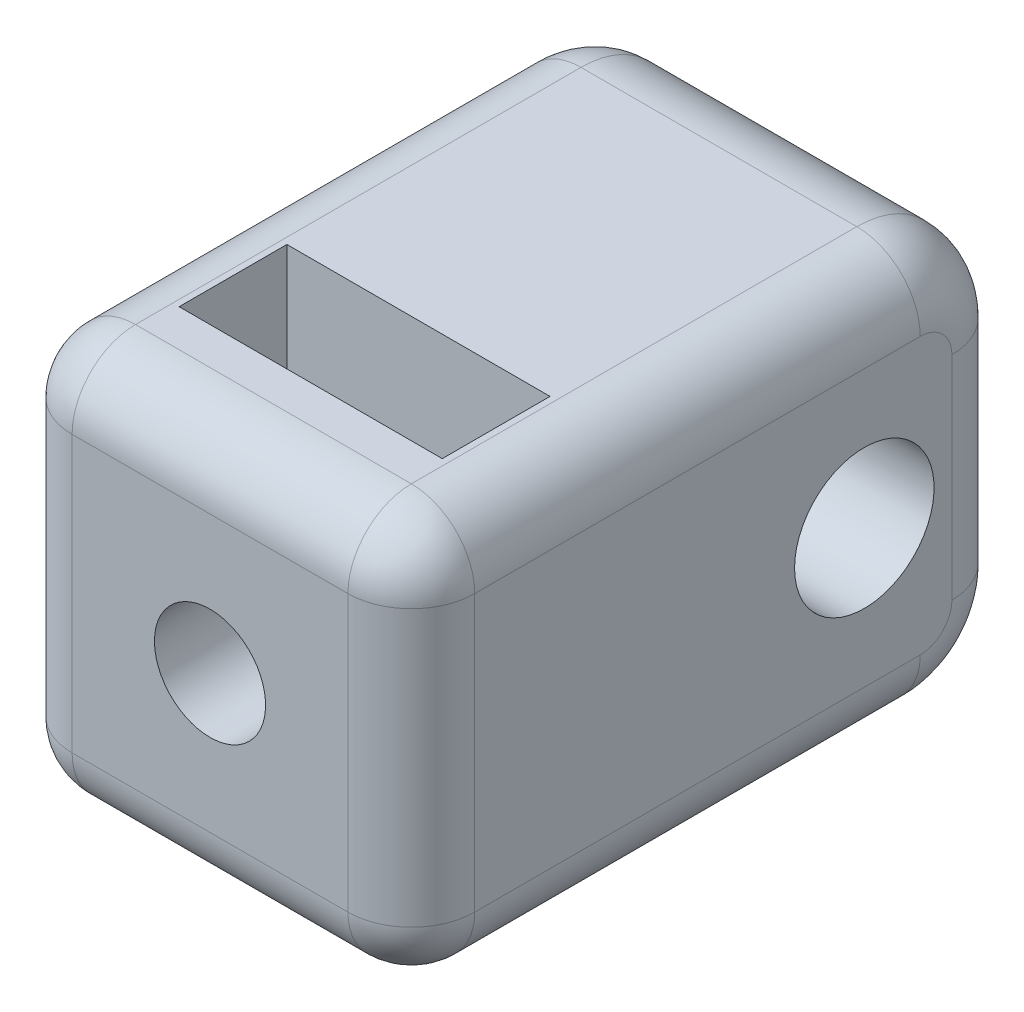
ISO-10303-21;
HEADER;
FILE_DESCRIPTION(('STEP AP214'),'2;1');
FILE_NAME('part.step','',(''),(''),'','','');
FILE_SCHEMA(('AUTOMOTIVE_DESIGN { 1 0 10303 214 1 1 1 1 }'));
ENDSEC;
DATA;
#1=APPLICATION_CONTEXT('core data for automotive mechanical design processes');
#2=APPLICATION_PROTOCOL_DEFINITION('international standard','automotive_design',2000,#1);
#3=PRODUCT_CONTEXT('',#1,'mechanical');
#4=PRODUCT('Part','Part','',(#3));
#5=PRODUCT_RELATED_PRODUCT_CATEGORY('part','',(#4));
#6=PRODUCT_DEFINITION_FORMATION('','',#4);
#7=PRODUCT_DEFINITION_CONTEXT('part definition',#1,'design');
#8=PRODUCT_DEFINITION('design','',#6,#7);
#9=PRODUCT_DEFINITION_SHAPE('','',#8);
#10=(LENGTH_UNIT() NAMED_UNIT(*) SI_UNIT(.MILLI.,.METRE.));
#11=(NAMED_UNIT(*) PLANE_ANGLE_UNIT() SI_UNIT($,.RADIAN.));
#12=(NAMED_UNIT(*) SI_UNIT($,.STERADIAN.) SOLID_ANGLE_UNIT());
#13=UNCERTAINTY_MEASURE_WITH_UNIT(LENGTH_MEASURE(1.E-05),#10,'distance_accuracy_value','');
#14=(GEOMETRIC_REPRESENTATION_CONTEXT(3) GLOBAL_UNCERTAINTY_ASSIGNED_CONTEXT((#13)) GLOBAL_UNIT_ASSIGNED_CONTEXT((#10,
#11,#12)) REPRESENTATION_CONTEXT('',''));
#15=CARTESIAN_POINT('',(0.,0.,0.));
#16=DIRECTION('',(0.,0.,1.));
#17=DIRECTION('',(1.,0.,0.));
#18=AXIS2_PLACEMENT_3D('',#15,#16,#17);
#19=CARTESIAN_POINT('',(0.,12.7,0.));
#20=DIRECTION('',(0.,-1.,0.));
#21=DIRECTION('',(0.,0.,-1.));
#22=AXIS2_PLACEMENT_3D('',#19,#20,#21);
#23=PLANE('',#22);
#24=DIRECTION('',(-1.,0.,0.));
#25=VECTOR('',#24,1.);
#26=CARTESIAN_POINT('',(0.,12.7,3.));
#27=LINE('',#26,#25);
#28=CARTESIAN_POINT('',(-40.1,12.7,3.));
#29=VERTEX_POINT('',#28);
#30=CARTESIAN_POINT('',(-48.8,12.7,3.));
#31=VERTEX_POINT('',#30);
#32=EDGE_CURVE('E257',#29,#31,#27,.T.);
#33=ORIENTED_EDGE('',*,*,#32,.T.);
#34=DIRECTION('',(0.,0.,1.));
#35=VECTOR('',#34,1.);
#36=CARTESIAN_POINT('',(-48.8,12.7,0.));
#37=LINE('',#36,#35);
#38=CARTESIAN_POINT('',(-48.8,12.7,17.05));
#39=VERTEX_POINT('',#38);
#40=EDGE_CURVE('E11',#31,#39,#37,.T.);
#41=ORIENTED_EDGE('',*,*,#40,.T.);
#42=DIRECTION('',(1.,0.,0.));
#43=VECTOR('',#42,1.);
#44=CARTESIAN_POINT('',(0.,12.7,17.05));
#45=LINE('',#44,#43);
#46=CARTESIAN_POINT('',(-40.1,12.7,17.05));
#47=VERTEX_POINT('',#46);
#48=EDGE_CURVE('E273',#39,#47,#45,.T.);
#49=ORIENTED_EDGE('',*,*,#48,.T.);
#50=DIRECTION('',(0.,0.,1.));
#51=VECTOR('',#50,1.);
#52=CARTESIAN_POINT('',(-40.1,12.7,0.));
#53=LINE('',#52,#51);
#54=EDGE_CURVE('E51',#47,#29,#53,.F.);
#55=ORIENTED_EDGE('',*,*,#54,.T.);
#56=EDGE_LOOP('',(#33,#41,#49,#55));
#57=FACE_BOUND('',#56,.T.);
#58=DIRECTION('',(1.,0.,0.));
#59=VECTOR('',#58,1.);
#60=CARTESIAN_POINT('',(0.,12.7,12.475));
#61=LINE('',#60,#59);
#62=CARTESIAN_POINT('',(-48.6,12.7,12.475));
#63=VERTEX_POINT('',#62);
#64=CARTESIAN_POINT('',(-40.3,12.7,12.475));
#65=VERTEX_POINT('',#64);
#66=EDGE_CURVE('E187',#63,#65,#61,.T.);
#67=ORIENTED_EDGE('',*,*,#66,.T.);
#68=DIRECTION('',(0.,0.,1.));
#69=VECTOR('',#68,1.);
#70=CARTESIAN_POINT('',(-40.3,12.7,12.475));
#71=LINE('',#70,#69);
#72=CARTESIAN_POINT('',(-40.3,12.7,15.875));
#73=VERTEX_POINT('',#72);
#74=EDGE_CURVE('E233',#65,#73,#71,.T.);
#75=ORIENTED_EDGE('',*,*,#74,.T.);
#76=DIRECTION('',(1.,0.,0.));
#77=VECTOR('',#76,1.);
#78=CARTESIAN_POINT('',(0.,12.7,15.875));
#79=LINE('',#78,#77);
#80=CARTESIAN_POINT('',(-48.6,12.7,15.875));
#81=VERTEX_POINT('',#80);
#82=EDGE_CURVE('E197',#81,#73,#79,.T.);
#83=ORIENTED_EDGE('',*,*,#82,.F.);
#84=DIRECTION('',(0.,0.,1.));
#85=VECTOR('',#84,1.);
#86=CARTESIAN_POINT('',(-48.6,12.7,12.475));
#87=LINE('',#86,#85);
#88=EDGE_CURVE('E229',#63,#81,#87,.T.);
#89=ORIENTED_EDGE('',*,*,#88,.F.);
#90=EDGE_LOOP('',(#67,#75,#83,#89));
#91=FACE_BOUND('',#90,.T.);
#92=ADVANCED_FACE('F41',(#57,#91),#23,.F.);
#93=CARTESIAN_POINT('',(0.,12.7,0.));
#94=DIRECTION('',(0.,0.,1.));
#95=DIRECTION('',(1.,0.,0.));
#96=AXIS2_PLACEMENT_3D('',#93,#94,#95);
#97=PLANE('',#96);
#98=DIRECTION('',(-1.,0.,0.));
#99=VECTOR('',#98,1.);
#100=CARTESIAN_POINT('',(-50.8,3.,0.));
#101=LINE('',#100,#99);
#102=CARTESIAN_POINT('',(-40.1,3.,0.));
#103=VERTEX_POINT('',#102);
#104=CARTESIAN_POINT('',(-48.8,3.,0.));
#105=VERTEX_POINT('',#104);
#106=EDGE_CURVE('E249',#103,#105,#101,.T.);
#107=ORIENTED_EDGE('',*,*,#106,.T.);
#108=DIRECTION('',(0.,-1.,0.));
#109=VECTOR('',#108,1.);
#110=CARTESIAN_POINT('',(-48.8,12.7,0.));
#111=LINE('',#110,#109);
#112=CARTESIAN_POINT('',(-48.8,9.7,0.));
#113=VERTEX_POINT('',#112);
#114=EDGE_CURVE('E307',#105,#113,#111,.F.);
#115=ORIENTED_EDGE('',*,*,#114,.T.);
#116=DIRECTION('',(-1.,0.,0.));
#117=VECTOR('',#116,1.);
#118=CARTESIAN_POINT('',(0.,9.7,0.));
#119=LINE('',#118,#117);
#120=CARTESIAN_POINT('',(-40.1,9.7,0.));
#121=VERTEX_POINT('',#120);
#122=EDGE_CURVE('E245',#113,#121,#119,.F.);
#123=ORIENTED_EDGE('',*,*,#122,.T.);
#124=DIRECTION('',(0.,1.,0.));
#125=VECTOR('',#124,1.);
#126=CARTESIAN_POINT('',(-40.1,12.7,0.));
#127=LINE('',#126,#125);
#128=EDGE_CURVE('E304',#121,#103,#127,.F.);
#129=ORIENTED_EDGE('',*,*,#128,.T.);
#130=EDGE_LOOP('',(#107,#115,#123,#129));
#131=FACE_BOUND('',#130,.T.);
#132=ADVANCED_FACE('F481',(#131),#97,.F.);
#133=CARTESIAN_POINT('',(-50.8,12.7,0.));
#134=DIRECTION('',(1.,0.,0.));
#135=DIRECTION('',(0.,0.,-1.));
#136=AXIS2_PLACEMENT_3D('',#133,#134,#135);
#137=PLANE('',#136);
#138=DIRECTION('',(0.,0.,1.));
#139=VECTOR('',#138,1.);
#140=CARTESIAN_POINT('',(-50.8,10.7,0.));
#141=LINE('',#140,#139);
#142=CARTESIAN_POINT('',(-50.8,10.7,17.05));
#143=VERTEX_POINT('',#142);
#144=CARTESIAN_POINT('',(-50.8,10.7,3.));
#145=VERTEX_POINT('',#144);
#146=EDGE_CURVE('E277',#143,#145,#141,.F.);
#147=ORIENTED_EDGE('',*,*,#146,.T.);
#148=CARTESIAN_POINT('',(-50.8,9.7,3.));
#149=DIRECTION('',(1.,0.,0.));
#150=DIRECTION('',(0.,0.,-1.));
#151=AXIS2_PLACEMENT_3D('',#148,#149,#150);
#152=CIRCLE('',#151,1.);
#153=CARTESIAN_POINT('',(-50.8,9.7,2.));
#154=VERTEX_POINT('',#153);
#155=EDGE_CURVE('E292',#145,#154,#152,.F.);
#156=ORIENTED_EDGE('',*,*,#155,.T.);
#157=DIRECTION('',(0.,-1.,0.));
#158=VECTOR('',#157,1.);
#159=CARTESIAN_POINT('',(-50.8,12.7,2.));
#160=LINE('',#159,#158);
#161=CARTESIAN_POINT('',(-50.8,3.,2.));
#162=VERTEX_POINT('',#161);
#163=EDGE_CURVE('E289',#154,#162,#160,.T.);
#164=ORIENTED_EDGE('',*,*,#163,.T.);
#165=CARTESIAN_POINT('',(-50.8,3.,3.));
#166=DIRECTION('',(1.,0.,0.));
#167=DIRECTION('',(0.,0.,-1.));
#168=AXIS2_PLACEMENT_3D('',#165,#166,#167);
#169=CIRCLE('',#168,1.);
#170=CARTESIAN_POINT('',(-50.8,2.,3.));
#171=VERTEX_POINT('',#170);
#172=EDGE_CURVE('E286',#162,#171,#169,.F.);
#173=ORIENTED_EDGE('',*,*,#172,.T.);
#174=DIRECTION('',(0.,0.,1.));
#175=VECTOR('',#174,1.);
#176=CARTESIAN_POINT('',(-50.8,2.,17.05));
#177=LINE('',#176,#175);
#178=CARTESIAN_POINT('',(-50.8,2.,17.05));
#179=VERTEX_POINT('',#178);
#180=EDGE_CURVE('E283',#171,#179,#177,.T.);
#181=ORIENTED_EDGE('',*,*,#180,.T.);
#182=DIRECTION('',(0.,-1.,0.));
#183=VECTOR('',#182,1.);
#184=CARTESIAN_POINT('',(-50.8,12.7,17.05));
#185=LINE('',#184,#183);
#186=EDGE_CURVE('E280',#179,#143,#185,.F.);
#187=ORIENTED_EDGE('',*,*,#186,.T.);
#188=EDGE_LOOP('',(#147,#156,#164,#173,#181,#187));
#189=FACE_BOUND('',#188,.T.);
#190=CARTESIAN_POINT('',(-50.8,6.35,4.7625));
#191=DIRECTION('',(-1.,0.,0.));
#192=DIRECTION('',(0.,0.,1.));
#193=AXIS2_PLACEMENT_3D('',#190,#191,#192);
#194=CIRCLE('',#193,2.2);
#195=CARTESIAN_POINT('',(-50.8,6.35,6.9625));
#196=VERTEX_POINT('',#195);
#197=EDGE_CURVE('E232',#196,#196,#194,.T.);
#198=ORIENTED_EDGE('',*,*,#197,.F.);
#199=EDGE_LOOP('',(#198));
#200=FACE_BOUND('',#199,.T.);
#201=ADVANCED_FACE('F452',(#189,#200),#137,.F.);
#202=CARTESIAN_POINT('',(0.,12.7,19.05));
#203=DIRECTION('',(0.,0.,-1.));
#204=DIRECTION('',(-1.,0.,0.));
#205=AXIS2_PLACEMENT_3D('',#202,#203,#204);
#206=PLANE('',#205);
#207=CARTESIAN_POINT('',(-44.45,6.35,19.05));
#208=DIRECTION('',(0.,0.,-1.));
#209=DIRECTION('',(-1.,0.,0.));
#210=AXIS2_PLACEMENT_3D('',#207,#208,#209);
#211=CIRCLE('',#210,1.7525);
#212=CARTESIAN_POINT('',(-46.2025,6.35,19.05));
#213=VERTEX_POINT('',#212);
#214=EDGE_CURVE('E850',#213,#213,#211,.T.);
#215=ORIENTED_EDGE('',*,*,#214,.T.);
#216=EDGE_LOOP('',(#215));
#217=FACE_BOUND('',#216,.T.);
#218=DIRECTION('',(1.,0.,0.));
#219=VECTOR('',#218,1.);
#220=CARTESIAN_POINT('',(0.,10.7,19.05));
#221=LINE('',#220,#219);
#222=CARTESIAN_POINT('',(-40.1,10.7,19.05));
#223=VERTEX_POINT('',#222);
#224=CARTESIAN_POINT('',(-48.8,10.7,19.05));
#225=VERTEX_POINT('',#224);
#226=EDGE_CURVE('E261',#223,#225,#221,.F.);
#227=ORIENTED_EDGE('',*,*,#226,.T.);
#228=DIRECTION('',(0.,-1.,0.));
#229=VECTOR('',#228,1.);
#230=CARTESIAN_POINT('',(-48.8,12.7,19.05));
#231=LINE('',#230,#229);
#232=CARTESIAN_POINT('',(-48.8,2.,19.05));
#233=VERTEX_POINT('',#232);
#234=EDGE_CURVE('E331',#225,#233,#231,.T.);
#235=ORIENTED_EDGE('',*,*,#234,.T.);
#236=DIRECTION('',(1.,0.,0.));
#237=VECTOR('',#236,1.);
#238=CARTESIAN_POINT('',(-38.1,2.,19.05));
#239=LINE('',#238,#237);
#240=CARTESIAN_POINT('',(-40.1,2.,19.05));
#241=VERTEX_POINT('',#240);
#242=EDGE_CURVE('E265',#233,#241,#239,.T.);
#243=ORIENTED_EDGE('',*,*,#242,.T.);
#244=DIRECTION('',(0.,1.,0.));
#245=VECTOR('',#244,1.);
#246=CARTESIAN_POINT('',(-40.1,12.7,19.05));
#247=LINE('',#246,#245);
#248=EDGE_CURVE('E328',#241,#223,#247,.T.);
#249=ORIENTED_EDGE('',*,*,#248,.T.);
#250=EDGE_LOOP('',(#227,#235,#243,#249));
#251=FACE_BOUND('',#250,.T.);
#252=ADVANCED_FACE('F433',(#217,#251),#206,.F.);
#253=CARTESIAN_POINT('',(0.,0.,0.));
#254=DIRECTION('',(0.,-1.,0.));
#255=DIRECTION('',(0.,0.,-1.));
#256=AXIS2_PLACEMENT_3D('',#253,#254,#255);
#257=PLANE('',#256);
#258=DIRECTION('',(1.,0.,0.));
#259=VECTOR('',#258,1.);
#260=CARTESIAN_POINT('',(-50.8,0.,17.05));
#261=LINE('',#260,#259);
#262=CARTESIAN_POINT('',(-40.1,0.,17.05));
#263=VERTEX_POINT('',#262);
#264=CARTESIAN_POINT('',(-48.8,0.,17.05));
#265=VERTEX_POINT('',#264);
#266=EDGE_CURVE('E269',#263,#265,#261,.F.);
#267=ORIENTED_EDGE('',*,*,#266,.T.);
#268=DIRECTION('',(0.,0.,1.));
#269=VECTOR('',#268,1.);
#270=CARTESIAN_POINT('',(-48.8,0.,3.00000000000001));
#271=LINE('',#270,#269);
#272=CARTESIAN_POINT('',(-48.8,0.,3.));
#273=VERTEX_POINT('',#272);
#274=EDGE_CURVE('E319',#265,#273,#271,.F.);
#275=ORIENTED_EDGE('',*,*,#274,.T.);
#276=DIRECTION('',(-1.,0.,0.));
#277=VECTOR('',#276,1.);
#278=CARTESIAN_POINT('',(-38.1,0.,3.));
#279=LINE('',#278,#277);
#280=CARTESIAN_POINT('',(-40.1,0.,3.));
#281=VERTEX_POINT('',#280);
#282=EDGE_CURVE('E253',#273,#281,#279,.F.);
#283=ORIENTED_EDGE('',*,*,#282,.T.);
#284=DIRECTION('',(0.,0.,1.));
#285=VECTOR('',#284,1.);
#286=CARTESIAN_POINT('',(-40.1,0.,17.05));
#287=LINE('',#286,#285);
#288=EDGE_CURVE('E316',#281,#263,#287,.T.);
#289=ORIENTED_EDGE('',*,*,#288,.T.);
#290=EDGE_LOOP('',(#267,#275,#283,#289));
#291=FACE_BOUND('',#290,.T.);
#292=ADVANCED_FACE('F464',(#291),#257,.T.);
#293=CARTESIAN_POINT('',(0.,6.35,4.76250000000002));
#294=DIRECTION('',(-1.,0.,0.));
#295=DIRECTION('',(0.,0.,1.));
#296=AXIS2_PLACEMENT_3D('',#293,#294,#295);
#297=CYLINDRICAL_SURFACE('',#296,2.2);
#298=CARTESIAN_POINT('',(-38.1,6.35,4.76250000000001));
#299=DIRECTION('',(-1.,0.,0.));
#300=DIRECTION('',(0.,0.,1.));
#301=AXIS2_PLACEMENT_3D('',#298,#299,#300);
#302=CIRCLE('',#301,2.2);
#303=CARTESIAN_POINT('',(-38.1,6.35,6.9625));
#304=VERTEX_POINT('',#303);
#305=EDGE_CURVE('E388',#304,#304,#302,.T.);
#306=CARTESIAN_POINT('',(-38.1,6.35,6.9625));
#307=CARTESIAN_POINT('',(-38.2322916666667,6.35,6.9625));
#308=CARTESIAN_POINT('',(-38.3645833333333,6.35,6.9625));
#309=CARTESIAN_POINT('',(-38.6291666666666,6.35,6.9625));
#310=CARTESIAN_POINT('',(-38.7614583333333,6.35,6.9625));
#311=CARTESIAN_POINT('',(-39.0260416666667,6.35,6.9625));
#312=CARTESIAN_POINT('',(-39.1583333333333,6.35,6.9625));
#313=CARTESIAN_POINT('',(-39.4229166666667,6.35,6.9625));
#314=CARTESIAN_POINT('',(-39.5552083333333,6.35,6.9625));
#315=CARTESIAN_POINT('',(-39.8197916666667,6.35,6.9625));
#316=CARTESIAN_POINT('',(-39.9520833333333,6.35,6.9625));
#317=CARTESIAN_POINT('',(-40.2166666666667,6.35,6.9625));
#318=CARTESIAN_POINT('',(-40.3489583333333,6.35,6.9625));
#319=CARTESIAN_POINT('',(-40.6135416666667,6.35,6.9625));
#320=CARTESIAN_POINT('',(-40.7458333333333,6.35,6.9625));
#321=CARTESIAN_POINT('',(-41.0104166666667,6.35,6.9625));
#322=CARTESIAN_POINT('',(-41.1427083333333,6.35,6.9625));
#323=CARTESIAN_POINT('',(-41.4072916666667,6.35,6.9625));
#324=CARTESIAN_POINT('',(-41.5395833333333,6.35,6.9625));
#325=CARTESIAN_POINT('',(-41.8041666666667,6.35,6.9625));
#326=CARTESIAN_POINT('',(-41.9364583333333,6.35,6.9625));
#327=CARTESIAN_POINT('',(-42.2010416666667,6.35,6.9625));
#328=CARTESIAN_POINT('',(-42.3333333333333,6.35,6.9625));
#329=CARTESIAN_POINT('',(-42.5979166666666,6.35,6.9625));
#330=CARTESIAN_POINT('',(-42.7302083333333,6.35,6.9625));
#331=CARTESIAN_POINT('',(-42.9947916666667,6.35,6.9625));
#332=CARTESIAN_POINT('',(-43.1270833333333,6.35,6.9625));
#333=CARTESIAN_POINT('',(-43.3916666666667,6.35,6.9625));
#334=CARTESIAN_POINT('',(-43.5239583333333,6.35,6.9625));
#335=CARTESIAN_POINT('',(-43.7885416666667,6.35,6.9625));
#336=CARTESIAN_POINT('',(-43.9208333333333,6.35,6.9625));
#337=CARTESIAN_POINT('',(-44.1854166666667,6.35,6.9625));
#338=CARTESIAN_POINT('',(-44.3177083333333,6.35,6.9625));
#339=CARTESIAN_POINT('',(-44.5822916666667,6.35,6.9625));
#340=CARTESIAN_POINT('',(-44.7145833333333,6.35,6.9625));
#341=CARTESIAN_POINT('',(-44.9791666666667,6.35,6.9625));
#342=CARTESIAN_POINT('',(-45.1114583333333,6.35,6.9625));
#343=CARTESIAN_POINT('',(-45.3760416666667,6.35,6.9625));
#344=CARTESIAN_POINT('',(-45.5083333333333,6.35,6.9625));
#345=CARTESIAN_POINT('',(-45.7729166666667,6.35,6.9625));
#346=CARTESIAN_POINT('',(-45.9052083333333,6.35,6.9625));
#347=CARTESIAN_POINT('',(-46.1697916666667,6.35,6.9625));
#348=CARTESIAN_POINT('',(-46.3020833333333,6.35,6.9625));
#349=CARTESIAN_POINT('',(-46.5666666666667,6.35,6.9625));
#350=CARTESIAN_POINT('',(-46.6989583333333,6.35,6.9625));
#351=CARTESIAN_POINT('',(-46.9635416666667,6.35,6.9625));
#352=CARTESIAN_POINT('',(-47.0958333333333,6.35,6.9625));
#353=CARTESIAN_POINT('',(-47.3604166666667,6.35,6.9625));
#354=CARTESIAN_POINT('',(-47.4927083333333,6.35,6.9625));
#355=CARTESIAN_POINT('',(-47.7572916666667,6.35,6.9625));
#356=CARTESIAN_POINT('',(-47.8895833333333,6.35,6.9625));
#357=CARTESIAN_POINT('',(-48.1541666666667,6.35,6.9625));
#358=CARTESIAN_POINT('',(-48.2864583333333,6.35,6.9625));
#359=CARTESIAN_POINT('',(-48.5510416666667,6.35,6.9625));
#360=CARTESIAN_POINT('',(-48.6833333333333,6.35,6.9625));
#361=CARTESIAN_POINT('',(-48.9479166666667,6.35,6.9625));
#362=CARTESIAN_POINT('',(-49.0802083333333,6.35,6.9625));
#363=CARTESIAN_POINT('',(-49.3447916666667,6.35,6.9625));
#364=CARTESIAN_POINT('',(-49.4770833333333,6.35,6.9625));
#365=CARTESIAN_POINT('',(-49.7416666666667,6.35,6.9625));
#366=CARTESIAN_POINT('',(-49.8739583333333,6.35,6.9625));
#367=CARTESIAN_POINT('',(-50.1385416666667,6.35,6.9625));
#368=CARTESIAN_POINT('',(-50.2708333333333,6.35,6.9625));
#369=CARTESIAN_POINT('',(-50.5354166666667,6.35,6.9625));
#370=CARTESIAN_POINT('',(-50.6677083333333,6.35,6.9625));
#371=CARTESIAN_POINT('',(-50.8,6.35,6.9625));
#372=B_SPLINE_CURVE_WITH_KNOTS('',3,(#306,#307,#308,#309,#310,#311,#312,#313,#314,#315,#316,
#317,#318,#319,#320,#321,#322,#323,#324,#325,#326,#327,#328,#329,#330,#331,#332,#333,#334,#335,
#336,#337,#338,#339,#340,#341,#342,#343,#344,#345,#346,#347,#348,#349,#350,#351,#352,#353,#354,
#355,#356,#357,#358,#359,#360,#361,#362,#363,#364,#365,#366,#367,#368,#369,#370,#371),
.UNSPECIFIED.,.F.,.F.,(4,2,2,2,2,2,2,2,2,2,2,2,2,2,2,2,2,2,2,2,2,2,2,2,2,2,2,2,2,2,2,2,4),(0.,
0.396874999999998,0.793750000000003,1.190625,1.5875,1.984375,2.38125,2.778125,3.175,3.571875,
3.96875,4.365625,4.7625,5.159375,5.55625,5.953125,6.35,6.746875,7.14375,7.540625,7.9375,
8.334375,8.73125,9.128125,9.52500000000001,9.921875,10.31875,10.715625,11.1125,11.509375,
11.90625,12.303125,12.7),.UNSPECIFIED.);
#373=EDGE_CURVE('BSEAM529',#304,#196,#372,.T.);
#374=ORIENTED_EDGE('',*,*,#305,.F.);
#375=ORIENTED_EDGE('',*,*,#197,.T.);
#376=ORIENTED_EDGE('',*,*,#373,.T.);
#377=ORIENTED_EDGE('',*,*,#373,.F.);
#378=EDGE_LOOP('',(#374,#376,#375,#377));
#379=FACE_BOUND('',#378,.T.);
#380=ADVANCED_FACE('F529',(#379),#297,.F.);
#381=CARTESIAN_POINT('',(-48.6,0.,12.475));
#382=DIRECTION('',(1.,0.,0.));
#383=DIRECTION('',(0.,0.,-1.));
#384=AXIS2_PLACEMENT_3D('',#381,#382,#383);
#385=PLANE('',#384);
#386=DIRECTION('',(0.,1.,0.));
#387=VECTOR('',#386,1.);
#388=CARTESIAN_POINT('',(-48.6,0.,15.875));
#389=LINE('',#388,#387);
#390=CARTESIAN_POINT('',(-48.6,3.95399638286305,15.875));
#391=VERTEX_POINT('',#390);
#392=EDGE_CURVE('E180',#391,#81,#389,.T.);
#393=ORIENTED_EDGE('',*,*,#392,.F.);
#394=DIRECTION('',(0.,0.,1.));
#395=VECTOR('',#394,1.);
#396=CARTESIAN_POINT('',(-48.6,3.95399638286305,12.475));
#397=LINE('',#396,#395);
#398=CARTESIAN_POINT('',(-48.6,3.95399638286305,12.475));
#399=VERTEX_POINT('',#398);
#400=EDGE_CURVE('E174',#399,#391,#397,.T.);
#401=ORIENTED_EDGE('',*,*,#400,.F.);
#402=DIRECTION('',(0.,1.,0.));
#403=VECTOR('',#402,1.);
#404=CARTESIAN_POINT('',(-48.6,0.,12.475));
#405=LINE('',#404,#403);
#406=EDGE_CURVE('E178',#399,#63,#405,.T.);
#407=ORIENTED_EDGE('',*,*,#406,.T.);
#408=ORIENTED_EDGE('',*,*,#88,.T.);
#409=EDGE_LOOP('',(#393,#401,#407,#408));
#410=FACE_BOUND('',#409,.T.);
#411=ADVANCED_FACE('F176',(#410),#385,.T.);
#412=CARTESIAN_POINT('',(-40.3,0.,12.475));
#413=DIRECTION('',(-1.,0.,0.));
#414=DIRECTION('',(0.,0.,1.));
#415=AXIS2_PLACEMENT_3D('',#412,#413,#414);
#416=PLANE('',#415);
#417=DIRECTION('',(0.,-1.,0.));
#418=VECTOR('',#417,1.);
#419=CARTESIAN_POINT('',(-40.3,0.,15.875));
#420=LINE('',#419,#418);
#421=CARTESIAN_POINT('',(-40.3,3.95399638286306,15.875));
#422=VERTEX_POINT('',#421);
#423=EDGE_CURVE('E223',#73,#422,#420,.T.);
#424=ORIENTED_EDGE('',*,*,#423,.F.);
#425=ORIENTED_EDGE('',*,*,#74,.F.);
#426=DIRECTION('',(0.,-1.,0.));
#427=VECTOR('',#426,1.);
#428=CARTESIAN_POINT('',(-40.3,0.,12.475));
#429=LINE('',#428,#427);
#430=CARTESIAN_POINT('',(-40.3,3.95399638286306,12.475));
#431=VERTEX_POINT('',#430);
#432=EDGE_CURVE('E205',#65,#431,#429,.T.);
#433=ORIENTED_EDGE('',*,*,#432,.T.);
#434=DIRECTION('',(0.,0.,1.));
#435=VECTOR('',#434,1.);
#436=CARTESIAN_POINT('',(-40.3,3.95399638286306,12.475));
#437=LINE('',#436,#435);
#438=EDGE_CURVE('E237',#431,#422,#437,.T.);
#439=ORIENTED_EDGE('',*,*,#438,.T.);
#440=EDGE_LOOP('',(#424,#425,#433,#439));
#441=FACE_BOUND('',#440,.T.);
#442=ADVANCED_FACE('F775',(#441),#416,.T.);
#443=CARTESIAN_POINT('',(-11.7871306570156,20.4159091734037,12.475));
#444=DIRECTION('',(0.5,-0.866025403784439,0.));
#445=DIRECTION('',(0.866025403784439,0.5,0.));
#446=AXIS2_PLACEMENT_3D('',#443,#444,#445);
#447=PLANE('',#446);
#448=DIRECTION('',(0.866025403784439,0.5,0.));
#449=VECTOR('',#448,1.);
#450=CARTESIAN_POINT('',(-11.7871306570156,20.4159091734037,15.875));
#451=LINE('',#450,#449);
#452=CARTESIAN_POINT('',(-44.45,1.55799276572612,15.875));
#453=VERTEX_POINT('',#452);
#454=EDGE_CURVE('E219',#453,#422,#451,.T.);
#455=ORIENTED_EDGE('',*,*,#454,.T.);
#456=ORIENTED_EDGE('',*,*,#438,.F.);
#457=DIRECTION('',(0.866025403784439,0.5,0.));
#458=VECTOR('',#457,1.);
#459=CARTESIAN_POINT('',(-11.7871306570156,20.4159091734037,12.475));
#460=LINE('',#459,#458);
#461=CARTESIAN_POINT('',(-44.45,1.55799276572612,12.475));
#462=VERTEX_POINT('',#461);
#463=EDGE_CURVE('E202',#462,#431,#460,.T.);
#464=ORIENTED_EDGE('',*,*,#463,.F.);
#465=DIRECTION('',(0.,0.,1.));
#466=VECTOR('',#465,1.);
#467=CARTESIAN_POINT('',(-44.45,1.55799276572612,12.475));
#468=LINE('',#467,#466);
#469=EDGE_CURVE('E186',#462,#453,#468,.T.);
#470=ORIENTED_EDGE('',*,*,#469,.T.);
#471=EDGE_LOOP('',(#455,#456,#464,#470));
#472=FACE_BOUND('',#471,.T.);
#473=ADVANCED_FACE('F768',(#472),#447,.F.);
#474=CARTESIAN_POINT('',(-10.4378693429844,-18.0789200248146,12.475));
#475=DIRECTION('',(-0.5,-0.866025403784439,0.));
#476=DIRECTION('',(0.866025403784439,-0.5,0.));
#477=AXIS2_PLACEMENT_3D('',#474,#475,#476);
#478=PLANE('',#477);
#479=DIRECTION('',(0.866025403784439,-0.5,0.));
#480=VECTOR('',#479,1.);
#481=CARTESIAN_POINT('',(-10.4378693429844,-18.0789200248146,15.875));
#482=LINE('',#481,#480);
#483=EDGE_CURVE('E215',#391,#453,#482,.T.);
#484=ORIENTED_EDGE('',*,*,#483,.T.);
#485=ORIENTED_EDGE('',*,*,#469,.F.);
#486=DIRECTION('',(0.866025403784439,-0.5,0.));
#487=VECTOR('',#486,1.);
#488=CARTESIAN_POINT('',(-10.4378693429844,-18.0789200248146,12.475));
#489=LINE('',#488,#487);
#490=EDGE_CURVE('E193',#399,#462,#489,.T.);
#491=ORIENTED_EDGE('',*,*,#490,.F.);
#492=ORIENTED_EDGE('',*,*,#400,.T.);
#493=EDGE_LOOP('',(#484,#485,#491,#492));
#494=FACE_BOUND('',#493,.T.);
#495=ADVANCED_FACE('F199',(#494),#478,.F.);
#496=CARTESIAN_POINT('',(0.,0.,12.475));
#497=DIRECTION('',(0.,0.,1.));
#498=DIRECTION('',(1.,0.,0.));
#499=AXIS2_PLACEMENT_3D('',#496,#497,#498);
#500=PLANE('',#499);
#501=CARTESIAN_POINT('',(-44.45,6.35,12.475));
#502=DIRECTION('',(0.,0.,1.));
#503=DIRECTION('',(1.,0.,0.));
#504=AXIS2_PLACEMENT_3D('',#501,#502,#503);
#505=CIRCLE('',#504,1.7525);
#506=CARTESIAN_POINT('',(-42.6975,6.35,12.475));
#507=VERTEX_POINT('',#506);
#508=EDGE_CURVE('E859',#507,#507,#505,.T.);
#509=ORIENTED_EDGE('',*,*,#508,.F.);
#510=EDGE_LOOP('',(#509));
#511=FACE_BOUND('',#510,.T.);
#512=ORIENTED_EDGE('',*,*,#406,.F.);
#513=ORIENTED_EDGE('',*,*,#490,.T.);
#514=ORIENTED_EDGE('',*,*,#463,.T.);
#515=ORIENTED_EDGE('',*,*,#432,.F.);
#516=ORIENTED_EDGE('',*,*,#66,.F.);
#517=EDGE_LOOP('',(#512,#513,#514,#515,#516));
#518=FACE_BOUND('',#517,.T.);
#519=ADVANCED_FACE('F191',(#511,#518),#500,.T.);
#520=CARTESIAN_POINT('',(0.,0.,15.875));
#521=DIRECTION('',(0.,0.,1.));
#522=DIRECTION('',(1.,0.,0.));
#523=AXIS2_PLACEMENT_3D('',#520,#521,#522);
#524=PLANE('',#523);
#525=CARTESIAN_POINT('',(-44.45,6.35,15.875));
#526=DIRECTION('',(0.,0.,1.));
#527=DIRECTION('',(1.,0.,0.));
#528=AXIS2_PLACEMENT_3D('',#525,#526,#527);
#529=CIRCLE('',#528,1.7525);
#530=CARTESIAN_POINT('',(-42.6975,6.35,15.875));
#531=VERTEX_POINT('',#530);
#532=EDGE_CURVE('E854',#531,#531,#529,.T.);
#533=ORIENTED_EDGE('',*,*,#532,.T.);
#534=EDGE_LOOP('',(#533));
#535=FACE_BOUND('',#534,.T.);
#536=ORIENTED_EDGE('',*,*,#392,.T.);
#537=ORIENTED_EDGE('',*,*,#82,.T.);
#538=ORIENTED_EDGE('',*,*,#423,.T.);
#539=ORIENTED_EDGE('',*,*,#454,.F.);
#540=ORIENTED_EDGE('',*,*,#483,.F.);
#541=EDGE_LOOP('',(#536,#537,#538,#539,#540));
#542=FACE_BOUND('',#541,.T.);
#543=ADVANCED_FACE('F724',(#535,#542),#524,.F.);
#544=CARTESIAN_POINT('',(-44.45,6.35,9.475));
#545=DIRECTION('',(0.,0.,1.));
#546=DIRECTION('',(1.,0.,0.));
#547=AXIS2_PLACEMENT_3D('',#544,#545,#546);
#548=CYLINDRICAL_SURFACE('',#547,1.7525);
#549=CARTESIAN_POINT('',(-44.45,6.35,9.475));
#550=DIRECTION('',(0.,0.,1.));
#551=DIRECTION('',(1.,0.,0.));
#552=AXIS2_PLACEMENT_3D('',#549,#550,#551);
#553=CIRCLE('',#552,1.7525);
#554=CARTESIAN_POINT('',(-42.6975,6.35,9.475));
#555=VERTEX_POINT('',#554);
#556=EDGE_CURVE('E216',#555,#555,#553,.T.);
#557=ORIENTED_EDGE('',*,*,#556,.F.);
#558=EDGE_LOOP('',(#557));
#559=FACE_BOUND('',#558,.T.);
#560=ORIENTED_EDGE('',*,*,#508,.T.);
#561=EDGE_LOOP('',(#560));
#562=FACE_BOUND('',#561,.T.);
#563=ADVANCED_FACE('F715',(#559,#562),#548,.F.);
#564=CARTESIAN_POINT('',(-44.45,6.35,9.475));
#565=DIRECTION('',(0.,0.,1.));
#566=DIRECTION('',(1.,0.,0.));
#567=AXIS2_PLACEMENT_3D('',#564,#565,#566);
#568=PLANE('',#567);
#569=ORIENTED_EDGE('',*,*,#556,.T.);
#570=EDGE_LOOP('',(#569));
#571=FACE_BOUND('',#570,.T.);
#572=ADVANCED_FACE('F704',(#571),#568,.T.);
#573=CARTESIAN_POINT('',(-44.45,6.35,19.051));
#574=DIRECTION('',(0.,0.,-1.));
#575=DIRECTION('',(-1.,0.,0.));
#576=AXIS2_PLACEMENT_3D('',#573,#574,#575);
#577=CYLINDRICAL_SURFACE('',#576,1.7525);
#578=ORIENTED_EDGE('',*,*,#532,.F.);
#579=EDGE_LOOP('',(#578));
#580=FACE_BOUND('',#579,.T.);
#581=ORIENTED_EDGE('',*,*,#214,.F.);
#582=EDGE_LOOP('',(#581));
#583=FACE_BOUND('',#582,.T.);
#584=ADVANCED_FACE('F695',(#580,#583),#577,.F.);
#585=CARTESIAN_POINT('',(-38.1,-0.000999999999999265,0.));
#586=DIRECTION('',(-1.,0.,0.));
#587=DIRECTION('',(0.,0.,1.));
#588=AXIS2_PLACEMENT_3D('',#585,#586,#587);
#589=PLANE('',#588);
#590=DIRECTION('',(0.,1.,0.));
#591=VECTOR('',#590,1.);
#592=CARTESIAN_POINT('',(-38.1,-0.000999999999999265,2.));
#593=LINE('',#592,#591);
#594=CARTESIAN_POINT('',(-38.1,3.,2.));
#595=VERTEX_POINT('',#594);
#596=CARTESIAN_POINT('',(-38.1,9.7,2.));
#597=VERTEX_POINT('',#596);
#598=EDGE_CURVE('E59',#595,#597,#593,.T.);
#599=ORIENTED_EDGE('',*,*,#598,.T.);
#600=CARTESIAN_POINT('',(-38.1,9.7,3.));
#601=DIRECTION('',(-1.,0.,0.));
#602=DIRECTION('',(0.,0.,1.));
#603=AXIS2_PLACEMENT_3D('',#600,#601,#602);
#604=CIRCLE('',#603,1.);
#605=CARTESIAN_POINT('',(-38.1,10.7,3.));
#606=VERTEX_POINT('',#605);
#607=EDGE_CURVE('E353',#597,#606,#604,.F.);
#608=ORIENTED_EDGE('',*,*,#607,.T.);
#609=DIRECTION('',(0.,0.,1.));
#610=VECTOR('',#609,1.);
#611=CARTESIAN_POINT('',(-38.1,10.7,0.));
#612=LINE('',#611,#610);
#613=CARTESIAN_POINT('',(-38.1,10.7,17.05));
#614=VERTEX_POINT('',#613);
#615=EDGE_CURVE('E340',#606,#614,#612,.T.);
#616=ORIENTED_EDGE('',*,*,#615,.T.);
#617=DIRECTION('',(0.,1.,0.));
#618=VECTOR('',#617,1.);
#619=CARTESIAN_POINT('',(-38.1,-0.000999999999999265,17.05));
#620=LINE('',#619,#618);
#621=CARTESIAN_POINT('',(-38.1,2.,17.05));
#622=VERTEX_POINT('',#621);
#623=EDGE_CURVE('E343',#614,#622,#620,.F.);
#624=ORIENTED_EDGE('',*,*,#623,.T.);
#625=DIRECTION('',(0.,0.,1.));
#626=VECTOR('',#625,1.);
#627=CARTESIAN_POINT('',(-38.1,2.,3.));
#628=LINE('',#627,#626);
#629=CARTESIAN_POINT('',(-38.1,2.,3.));
#630=VERTEX_POINT('',#629);
#631=EDGE_CURVE('E346',#622,#630,#628,.F.);
#632=ORIENTED_EDGE('',*,*,#631,.T.);
#633=CARTESIAN_POINT('',(-38.1,3.,3.));
#634=DIRECTION('',(-1.,0.,0.));
#635=DIRECTION('',(0.,0.,1.));
#636=AXIS2_PLACEMENT_3D('',#633,#634,#635);
#637=CIRCLE('',#636,1.);
#638=EDGE_CURVE('E64',#630,#595,#637,.F.);
#639=ORIENTED_EDGE('',*,*,#638,.T.);
#640=EDGE_LOOP('',(#599,#608,#616,#624,#632,#639));
#641=FACE_BOUND('',#640,.T.);
#642=ORIENTED_EDGE('',*,*,#305,.T.);
#643=EDGE_LOOP('',(#642));
#644=FACE_BOUND('',#643,.T.);
#645=ADVANCED_FACE('F540',(#641,#644),#589,.F.);
#646=CARTESIAN_POINT('',(0.,3.,3.));
#647=DIRECTION('',(1.,0.,0.));
#648=DIRECTION('',(0.,0.,-1.));
#649=AXIS2_PLACEMENT_3D('',#646,#647,#648);
#650=CYLINDRICAL_SURFACE('',#649,3.);
#651=ORIENTED_EDGE('',*,*,#282,.F.);
#652=CARTESIAN_POINT('',(-48.8,3.,3.));
#653=DIRECTION('',(1.,0.,0.));
#654=DIRECTION('',(0.,0.,-1.));
#655=AXIS2_PLACEMENT_3D('',#652,#653,#654);
#656=CIRCLE('',#655,3.);
#657=EDGE_CURVE('E313',#273,#105,#656,.T.);
#658=ORIENTED_EDGE('',*,*,#657,.T.);
#659=ORIENTED_EDGE('',*,*,#106,.F.);
#660=CARTESIAN_POINT('',(-40.1,3.,3.));
#661=DIRECTION('',(-1.,0.,0.));
#662=DIRECTION('',(0.,0.,1.));
#663=AXIS2_PLACEMENT_3D('',#660,#661,#662);
#664=CIRCLE('',#663,3.);
#665=EDGE_CURVE('E310',#103,#281,#664,.T.);
#666=ORIENTED_EDGE('',*,*,#665,.T.);
#667=EDGE_LOOP('',(#651,#658,#659,#666));
#668=FACE_BOUND('',#667,.T.);
#669=ADVANCED_FACE('F467',(#668),#650,.T.);
#670=CARTESIAN_POINT('',(0.,9.7,3.));
#671=DIRECTION('',(-1.,0.,0.));
#672=DIRECTION('',(0.,0.,1.));
#673=AXIS2_PLACEMENT_3D('',#670,#671,#672);
#674=CYLINDRICAL_SURFACE('',#673,3.);
#675=ORIENTED_EDGE('',*,*,#122,.F.);
#676=CARTESIAN_POINT('',(-48.8,9.7,3.));
#677=DIRECTION('',(1.,0.,0.));
#678=DIRECTION('',(0.,0.,-1.));
#679=AXIS2_PLACEMENT_3D('',#676,#677,#678);
#680=CIRCLE('',#679,3.);
#681=EDGE_CURVE('E300',#113,#31,#680,.T.);
#682=ORIENTED_EDGE('',*,*,#681,.T.);
#683=ORIENTED_EDGE('',*,*,#32,.F.);
#684=CARTESIAN_POINT('',(-40.1,9.7,3.));
#685=DIRECTION('',(-1.,0.,0.));
#686=DIRECTION('',(0.,0.,1.));
#687=AXIS2_PLACEMENT_3D('',#684,#685,#686);
#688=CIRCLE('',#687,3.);
#689=EDGE_CURVE('E296',#29,#121,#688,.T.);
#690=ORIENTED_EDGE('',*,*,#689,.T.);
#691=EDGE_LOOP('',(#675,#682,#683,#690));
#692=FACE_BOUND('',#691,.T.);
#693=ADVANCED_FACE('F484',(#692),#674,.T.);
#694=CARTESIAN_POINT('',(0.,2.,17.05));
#695=DIRECTION('',(-1.,0.,0.));
#696=DIRECTION('',(0.,0.,1.));
#697=AXIS2_PLACEMENT_3D('',#694,#695,#696);
#698=CYLINDRICAL_SURFACE('',#697,2.);
#699=ORIENTED_EDGE('',*,*,#242,.F.);
#700=CARTESIAN_POINT('',(-48.8,2.,17.05));
#701=DIRECTION('',(-1.,0.,0.));
#702=DIRECTION('',(0.,0.,1.));
#703=AXIS2_PLACEMENT_3D('',#700,#701,#702);
#704=CIRCLE('',#703,2.);
#705=EDGE_CURVE('E325',#233,#265,#704,.F.);
#706=ORIENTED_EDGE('',*,*,#705,.T.);
#707=ORIENTED_EDGE('',*,*,#266,.F.);
#708=CARTESIAN_POINT('',(-40.1,2.,17.05));
#709=DIRECTION('',(-1.,0.,0.));
#710=DIRECTION('',(0.,0.,1.));
#711=AXIS2_PLACEMENT_3D('',#708,#709,#710);
#712=CIRCLE('',#711,2.);
#713=EDGE_CURVE('E322',#263,#241,#712,.T.);
#714=ORIENTED_EDGE('',*,*,#713,.T.);
#715=EDGE_LOOP('',(#699,#706,#707,#714));
#716=FACE_BOUND('',#715,.T.);
#717=ADVANCED_FACE('F430',(#716),#698,.T.);
#718=CARTESIAN_POINT('',(0.,10.7,17.05));
#719=DIRECTION('',(1.,0.,0.));
#720=DIRECTION('',(0.,0.,-1.));
#721=AXIS2_PLACEMENT_3D('',#718,#719,#720);
#722=CYLINDRICAL_SURFACE('',#721,2.);
#723=ORIENTED_EDGE('',*,*,#48,.F.);
#724=CARTESIAN_POINT('',(-48.8,10.7,17.05));
#725=DIRECTION('',(1.,0.,0.));
#726=DIRECTION('',(0.,0.,-1.));
#727=AXIS2_PLACEMENT_3D('',#724,#725,#726);
#728=CIRCLE('',#727,2.);
#729=EDGE_CURVE('E337',#39,#225,#728,.T.);
#730=ORIENTED_EDGE('',*,*,#729,.T.);
#731=ORIENTED_EDGE('',*,*,#226,.F.);
#732=CARTESIAN_POINT('',(-40.1,10.7,17.05));
#733=DIRECTION('',(1.,0.,0.));
#734=DIRECTION('',(0.,0.,-1.));
#735=AXIS2_PLACEMENT_3D('',#732,#733,#734);
#736=CIRCLE('',#735,2.);
#737=EDGE_CURVE('E334',#223,#47,#736,.F.);
#738=ORIENTED_EDGE('',*,*,#737,.T.);
#739=EDGE_LOOP('',(#723,#730,#731,#738));
#740=FACE_BOUND('',#739,.T.);
#741=ADVANCED_FACE('F494',(#740),#722,.T.);
#742=CARTESIAN_POINT('',(-48.8,2.,17.05));
#743=DIRECTION('',(1.,0.,0.));
#744=DIRECTION('',(0.,0.,-1.));
#745=AXIS2_PLACEMENT_3D('',#742,#743,#744);
#746=SPHERICAL_SURFACE('',#745,2.);
#747=CARTESIAN_POINT('',(-48.8,2.,17.05));
#748=DIRECTION('',(0.,0.,-1.));
#749=DIRECTION('',(-1.,0.,0.));
#750=AXIS2_PLACEMENT_3D('',#747,#748,#749);
#751=CIRCLE('',#750,2.);
#752=EDGE_CURVE('E380',#265,#179,#751,.T.);
#753=ORIENTED_EDGE('',*,*,#752,.F.);
#754=ORIENTED_EDGE('',*,*,#705,.F.);
#755=CARTESIAN_POINT('',(-48.8,2.,17.05));
#756=DIRECTION('',(0.,1.,0.));
#757=DIRECTION('',(0.,0.,1.));
#758=AXIS2_PLACEMENT_3D('',#755,#756,#757);
#759=CIRCLE('',#758,2.);
#760=EDGE_CURVE('E384',#179,#233,#759,.T.);
#761=ORIENTED_EDGE('',*,*,#760,.F.);
#762=EDGE_LOOP('',(#753,#754,#761));
#763=FACE_BOUND('',#762,.T.);
#764=ADVANCED_FACE('F462',(#763),#746,.T.);
#765=CARTESIAN_POINT('',(-48.8,12.7,17.05));
#766=DIRECTION('',(0.,-1.,0.));
#767=DIRECTION('',(0.,0.,-1.));
#768=AXIS2_PLACEMENT_3D('',#765,#766,#767);
#769=CYLINDRICAL_SURFACE('',#768,2.);
#770=ORIENTED_EDGE('',*,*,#760,.T.);
#771=ORIENTED_EDGE('',*,*,#234,.F.);
#772=CARTESIAN_POINT('',(-48.8,10.7,17.05));
#773=DIRECTION('',(0.,1.,0.));
#774=DIRECTION('',(0.,0.,1.));
#775=AXIS2_PLACEMENT_3D('',#772,#773,#774);
#776=CIRCLE('',#775,2.);
#777=EDGE_CURVE('E376',#143,#225,#776,.T.);
#778=ORIENTED_EDGE('',*,*,#777,.F.);
#779=ORIENTED_EDGE('',*,*,#186,.F.);
#780=EDGE_LOOP('',(#770,#771,#778,#779));
#781=FACE_BOUND('',#780,.T.);
#782=ADVANCED_FACE('F438',(#781),#769,.T.);
#783=CARTESIAN_POINT('',(-48.8,2.,0.));
#784=DIRECTION('',(0.,0.,-1.));
#785=DIRECTION('',(-1.,0.,0.));
#786=AXIS2_PLACEMENT_3D('',#783,#784,#785);
#787=CYLINDRICAL_SURFACE('',#786,2.);
#788=ORIENTED_EDGE('',*,*,#752,.T.);
#789=ORIENTED_EDGE('',*,*,#180,.F.);
#790=CARTESIAN_POINT('',(-48.8,2.,3.));
#791=DIRECTION('',(0.,0.,-1.));
#792=DIRECTION('',(-1.,0.,0.));
#793=AXIS2_PLACEMENT_3D('',#790,#791,#792);
#794=CIRCLE('',#793,2.);
#795=EDGE_CURVE('E372',#273,#171,#794,.T.);
#796=ORIENTED_EDGE('',*,*,#795,.F.);
#797=ORIENTED_EDGE('',*,*,#274,.F.);
#798=EDGE_LOOP('',(#788,#789,#796,#797));
#799=FACE_BOUND('',#798,.T.);
#800=ADVANCED_FACE('F460',(#799),#787,.T.);
#801=CARTESIAN_POINT('',(-48.8,10.7,17.05));
#802=DIRECTION('',(1.,0.,0.));
#803=DIRECTION('',(0.,0.,-1.));
#804=AXIS2_PLACEMENT_3D('',#801,#802,#803);
#805=SPHERICAL_SURFACE('',#804,2.);
#806=ORIENTED_EDGE('',*,*,#777,.T.);
#807=ORIENTED_EDGE('',*,*,#729,.F.);
#808=CARTESIAN_POINT('',(-48.8,10.7,17.05));
#809=DIRECTION('',(0.,0.,-1.));
#810=DIRECTION('',(-1.,0.,0.));
#811=AXIS2_PLACEMENT_3D('',#808,#809,#810);
#812=CIRCLE('',#811,2.);
#813=EDGE_CURVE('E368',#143,#39,#812,.T.);
#814=ORIENTED_EDGE('',*,*,#813,.F.);
#815=EDGE_LOOP('',(#806,#807,#814));
#816=FACE_BOUND('',#815,.T.);
#817=ADVANCED_FACE('F444',(#816),#805,.T.);
#818=CARTESIAN_POINT('',(-48.8,3.,3.));
#819=DIRECTION('',(1.,0.,0.));
#820=DIRECTION('',(0.,0.,-1.));
#821=AXIS2_PLACEMENT_3D('',#818,#819,#820);
#822=DEGENERATE_TOROIDAL_SURFACE('',#821,1.,2.,.T.);
#823=ORIENTED_EDGE('',*,*,#795,.T.);
#824=ORIENTED_EDGE('',*,*,#172,.F.);
#825=CARTESIAN_POINT('',(-48.8,3.,2.));
#826=DIRECTION('',(0.,1.,0.));
#827=DIRECTION('',(0.,0.,1.));
#828=AXIS2_PLACEMENT_3D('',#825,#826,#827);
#829=CIRCLE('',#828,2.);
#830=EDGE_CURVE('E364',#105,#162,#829,.T.);
#831=ORIENTED_EDGE('',*,*,#830,.F.);
#832=ORIENTED_EDGE('',*,*,#657,.F.);
#833=EDGE_LOOP('',(#823,#824,#831,#832));
#834=FACE_BOUND('',#833,.T.);
#835=ADVANCED_FACE('F473',(#834),#822,.T.);
#836=CARTESIAN_POINT('',(-48.8,10.7,0.));
#837=DIRECTION('',(0.,0.,1.));
#838=DIRECTION('',(1.,0.,0.));
#839=AXIS2_PLACEMENT_3D('',#836,#837,#838);
#840=CYLINDRICAL_SURFACE('',#839,2.);
#841=ORIENTED_EDGE('',*,*,#813,.T.);
#842=ORIENTED_EDGE('',*,*,#40,.F.);
#843=CARTESIAN_POINT('',(-48.8,10.7,3.));
#844=DIRECTION('',(0.,0.,-1.));
#845=DIRECTION('',(-1.,0.,0.));
#846=AXIS2_PLACEMENT_3D('',#843,#844,#845);
#847=CIRCLE('',#846,2.);
#848=EDGE_CURVE('E361',#145,#31,#847,.T.);
#849=ORIENTED_EDGE('',*,*,#848,.F.);
#850=ORIENTED_EDGE('',*,*,#146,.F.);
#851=EDGE_LOOP('',(#841,#842,#849,#850));
#852=FACE_BOUND('',#851,.T.);
#853=ADVANCED_FACE('F449',(#852),#840,.T.);
#854=CARTESIAN_POINT('',(-48.8,12.7,2.));
#855=DIRECTION('',(0.,-1.,0.));
#856=DIRECTION('',(0.,0.,-1.));
#857=AXIS2_PLACEMENT_3D('',#854,#855,#856);
#858=CYLINDRICAL_SURFACE('',#857,2.);
#859=ORIENTED_EDGE('',*,*,#830,.T.);
#860=ORIENTED_EDGE('',*,*,#163,.F.);
#861=CARTESIAN_POINT('',(-48.8,9.7,2.));
#862=DIRECTION('',(0.,1.,0.));
#863=DIRECTION('',(0.,0.,1.));
#864=AXIS2_PLACEMENT_3D('',#861,#862,#863);
#865=CIRCLE('',#864,2.);
#866=EDGE_CURVE('E358',#113,#154,#865,.T.);
#867=ORIENTED_EDGE('',*,*,#866,.F.);
#868=ORIENTED_EDGE('',*,*,#114,.F.);
#869=EDGE_LOOP('',(#859,#860,#867,#868));
#870=FACE_BOUND('',#869,.T.);
#871=ADVANCED_FACE('F478',(#870),#858,.T.);
#872=CARTESIAN_POINT('',(-48.8,9.7,3.));
#873=DIRECTION('',(1.,0.,0.));
#874=DIRECTION('',(0.,0.,-1.));
#875=AXIS2_PLACEMENT_3D('',#872,#873,#874);
#876=DEGENERATE_TOROIDAL_SURFACE('',#875,1.,2.,.T.);
#877=ORIENTED_EDGE('',*,*,#848,.T.);
#878=ORIENTED_EDGE('',*,*,#681,.F.);
#879=ORIENTED_EDGE('',*,*,#866,.T.);
#880=ORIENTED_EDGE('',*,*,#155,.F.);
#881=EDGE_LOOP('',(#877,#878,#879,#880));
#882=FACE_BOUND('',#881,.T.);
#883=ADVANCED_FACE('F488',(#882),#876,.T.);
#884=CARTESIAN_POINT('',(-40.1,2.,17.05));
#885=DIRECTION('',(-1.,0.,0.));
#886=DIRECTION('',(0.,0.,1.));
#887=AXIS2_PLACEMENT_3D('',#884,#885,#886);
#888=SPHERICAL_SURFACE('',#887,2.);
#889=CARTESIAN_POINT('',(-40.1,2.,17.05));
#890=DIRECTION('',(0.,1.,0.));
#891=DIRECTION('',(0.,0.,1.));
#892=AXIS2_PLACEMENT_3D('',#889,#890,#891);
#893=CIRCLE('',#892,2.);
#894=EDGE_CURVE('E410',#241,#622,#893,.T.);
#895=ORIENTED_EDGE('',*,*,#894,.F.);
#896=ORIENTED_EDGE('',*,*,#713,.F.);
#897=CARTESIAN_POINT('',(-40.1,2.,17.05));
#898=DIRECTION('',(0.,0.,-1.));
#899=DIRECTION('',(-1.,0.,0.));
#900=AXIS2_PLACEMENT_3D('',#897,#898,#899);
#901=CIRCLE('',#900,2.);
#902=EDGE_CURVE('E45',#622,#263,#901,.T.);
#903=ORIENTED_EDGE('',*,*,#902,.F.);
#904=EDGE_LOOP('',(#895,#896,#903));
#905=FACE_BOUND('',#904,.T.);
#906=ADVANCED_FACE('F43',(#905),#888,.T.);
#907=CARTESIAN_POINT('',(-40.1,2.,0.));
#908=DIRECTION('',(0.,0.,-1.));
#909=DIRECTION('',(-1.,0.,0.));
#910=AXIS2_PLACEMENT_3D('',#907,#908,#909);
#911=CYLINDRICAL_SURFACE('',#910,2.);
#912=ORIENTED_EDGE('',*,*,#902,.T.);
#913=ORIENTED_EDGE('',*,*,#288,.F.);
#914=CARTESIAN_POINT('',(-40.1,2.,3.));
#915=DIRECTION('',(0.,0.,-1.));
#916=DIRECTION('',(-1.,0.,0.));
#917=AXIS2_PLACEMENT_3D('',#914,#915,#916);
#918=CIRCLE('',#917,2.);
#919=EDGE_CURVE('E407',#630,#281,#918,.T.);
#920=ORIENTED_EDGE('',*,*,#919,.F.);
#921=ORIENTED_EDGE('',*,*,#631,.F.);
#922=EDGE_LOOP('',(#912,#913,#920,#921));
#923=FACE_BOUND('',#922,.T.);
#924=ADVANCED_FACE('F423',(#923),#911,.T.);
#925=CARTESIAN_POINT('',(-40.1,12.7,17.05));
#926=DIRECTION('',(0.,1.,0.));
#927=DIRECTION('',(0.,0.,1.));
#928=AXIS2_PLACEMENT_3D('',#925,#926,#927);
#929=CYLINDRICAL_SURFACE('',#928,2.);
#930=ORIENTED_EDGE('',*,*,#894,.T.);
#931=ORIENTED_EDGE('',*,*,#623,.F.);
#932=CARTESIAN_POINT('',(-40.1,10.7,17.05));
#933=DIRECTION('',(0.,1.,0.));
#934=DIRECTION('',(0.,0.,1.));
#935=AXIS2_PLACEMENT_3D('',#932,#933,#934);
#936=CIRCLE('',#935,2.);
#937=EDGE_CURVE('E403',#223,#614,#936,.T.);
#938=ORIENTED_EDGE('',*,*,#937,.F.);
#939=ORIENTED_EDGE('',*,*,#248,.F.);
#940=EDGE_LOOP('',(#930,#931,#938,#939));
#941=FACE_BOUND('',#940,.T.);
#942=ADVANCED_FACE('F513',(#941),#929,.T.);
#943=CARTESIAN_POINT('',(-40.1,3.,3.));
#944=DIRECTION('',(-1.,0.,0.));
#945=DIRECTION('',(0.,0.,1.));
#946=AXIS2_PLACEMENT_3D('',#943,#944,#945);
#947=DEGENERATE_TOROIDAL_SURFACE('',#946,1.,2.,.T.);
#948=ORIENTED_EDGE('',*,*,#919,.T.);
#949=ORIENTED_EDGE('',*,*,#665,.F.);
#950=CARTESIAN_POINT('',(-40.1,3.,2.));
#951=DIRECTION('',(0.,1.,0.));
#952=DIRECTION('',(0.,0.,1.));
#953=AXIS2_PLACEMENT_3D('',#950,#951,#952);
#954=CIRCLE('',#953,2.);
#955=EDGE_CURVE('E399',#595,#103,#954,.T.);
#956=ORIENTED_EDGE('',*,*,#955,.F.);
#957=ORIENTED_EDGE('',*,*,#638,.F.);
#958=EDGE_LOOP('',(#948,#949,#956,#957));
#959=FACE_BOUND('',#958,.T.);
#960=ADVANCED_FACE('F511',(#959),#947,.T.);
#961=CARTESIAN_POINT('',(-40.1,10.7,17.05));
#962=DIRECTION('',(-1.,0.,0.));
#963=DIRECTION('',(0.,0.,1.));
#964=AXIS2_PLACEMENT_3D('',#961,#962,#963);
#965=SPHERICAL_SURFACE('',#964,2.);
#966=ORIENTED_EDGE('',*,*,#737,.F.);
#967=ORIENTED_EDGE('',*,*,#937,.T.);
#968=CARTESIAN_POINT('',(-40.1,10.7,17.05));
#969=DIRECTION('',(0.,0.,-1.));
#970=DIRECTION('',(-1.,0.,0.));
#971=AXIS2_PLACEMENT_3D('',#968,#969,#970);
#972=CIRCLE('',#971,2.);
#973=EDGE_CURVE('E395',#47,#614,#972,.T.);
#974=ORIENTED_EDGE('',*,*,#973,.F.);
#975=EDGE_LOOP('',(#966,#967,#974));
#976=FACE_BOUND('',#975,.T.);
#977=ADVANCED_FACE('F498',(#976),#965,.T.);
#978=CARTESIAN_POINT('',(-40.1,-0.000999999999999265,2.));
#979=DIRECTION('',(0.,1.,0.));
#980=DIRECTION('',(0.,0.,1.));
#981=AXIS2_PLACEMENT_3D('',#978,#979,#980);
#982=CYLINDRICAL_SURFACE('',#981,2.);
#983=ORIENTED_EDGE('',*,*,#955,.T.);
#984=ORIENTED_EDGE('',*,*,#128,.F.);
#985=CARTESIAN_POINT('',(-40.1,9.7,2.));
#986=DIRECTION('',(0.,1.,0.));
#987=DIRECTION('',(0.,0.,1.));
#988=AXIS2_PLACEMENT_3D('',#985,#986,#987);
#989=CIRCLE('',#988,2.);
#990=EDGE_CURVE('E392',#597,#121,#989,.T.);
#991=ORIENTED_EDGE('',*,*,#990,.F.);
#992=ORIENTED_EDGE('',*,*,#598,.F.);
#993=EDGE_LOOP('',(#983,#984,#991,#992));
#994=FACE_BOUND('',#993,.T.);
#995=ADVANCED_FACE('F509',(#994),#982,.T.);
#996=CARTESIAN_POINT('',(-40.1,10.7,0.));
#997=DIRECTION('',(0.,0.,1.));
#998=DIRECTION('',(1.,0.,0.));
#999=AXIS2_PLACEMENT_3D('',#996,#997,#998);
#1000=CYLINDRICAL_SURFACE('',#999,2.);
#1001=ORIENTED_EDGE('',*,*,#973,.T.);
#1002=ORIENTED_EDGE('',*,*,#615,.F.);
#1003=CARTESIAN_POINT('',(-40.1,10.7,3.));
#1004=DIRECTION('',(0.,0.,-1.));
#1005=DIRECTION('',(-1.,0.,0.));
#1006=AXIS2_PLACEMENT_3D('',#1003,#1004,#1005);
#1007=CIRCLE('',#1006,2.);
#1008=EDGE_CURVE('E389',#29,#606,#1007,.T.);
#1009=ORIENTED_EDGE('',*,*,#1008,.F.);
#1010=ORIENTED_EDGE('',*,*,#54,.F.);
#1011=EDGE_LOOP('',(#1001,#1002,#1009,#1010));
#1012=FACE_BOUND('',#1011,.T.);
#1013=ADVANCED_FACE('F503',(#1012),#1000,.T.);
#1014=CARTESIAN_POINT('',(-40.1,9.7,3.));
#1015=DIRECTION('',(-1.,0.,0.));
#1016=DIRECTION('',(0.,0.,1.));
#1017=AXIS2_PLACEMENT_3D('',#1014,#1015,#1016);
#1018=DEGENERATE_TOROIDAL_SURFACE('',#1017,1.,2.,.T.);
#1019=ORIENTED_EDGE('',*,*,#990,.T.);
#1020=ORIENTED_EDGE('',*,*,#689,.F.);
#1021=ORIENTED_EDGE('',*,*,#1008,.T.);
#1022=ORIENTED_EDGE('',*,*,#607,.F.);
#1023=EDGE_LOOP('',(#1019,#1020,#1021,#1022));
#1024=FACE_BOUND('',#1023,.T.);
#1025=ADVANCED_FACE('F505',(#1024),#1018,.T.);
#1026=CLOSED_SHELL('',(#92,#132,#201,#252,#292,#380,#411,#442,#473,#495,#519,#543,#563,#572,
#584,#645,#669,#693,#717,#741,#764,#782,#800,#817,#835,#853,#871,#883,#906,#924,#942,#960,#977,
#995,#1013,#1025));
#1027=MANIFOLD_SOLID_BREP('B2',#1026);
#1028=ADVANCED_BREP_SHAPE_REPRESENTATION('',(#18,#1027),#14);
#1029=SHAPE_DEFINITION_REPRESENTATION(#9,#1028);
ENDSEC;
END-ISO-10303-21;
